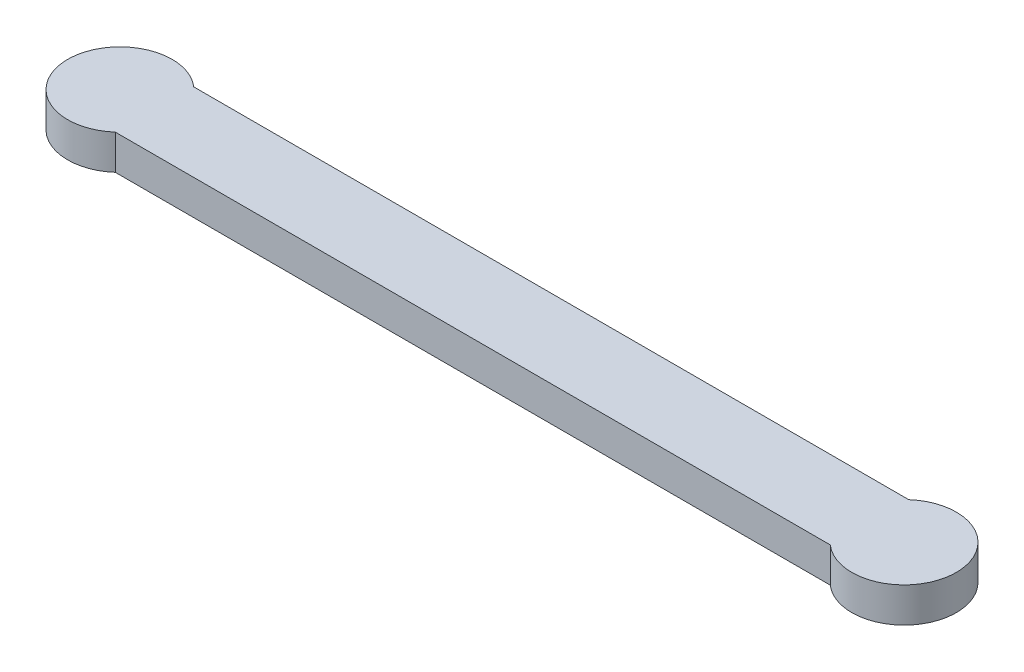
ISO-10303-21;
HEADER;
FILE_DESCRIPTION(('STEP AP214'),'2;1');
FILE_NAME('part.step','',(''),(''),'','','');
FILE_SCHEMA(('AUTOMOTIVE_DESIGN { 1 0 10303 214 1 1 1 1 }'));
ENDSEC;
DATA;
#1=APPLICATION_CONTEXT('core data for automotive mechanical design processes');
#2=APPLICATION_PROTOCOL_DEFINITION('international standard','automotive_design',2000,#1);
#3=PRODUCT_CONTEXT('',#1,'mechanical');
#4=PRODUCT('Part','Part','',(#3));
#5=PRODUCT_RELATED_PRODUCT_CATEGORY('part','',(#4));
#6=PRODUCT_DEFINITION_FORMATION('','',#4);
#7=PRODUCT_DEFINITION_CONTEXT('part definition',#1,'design');
#8=PRODUCT_DEFINITION('design','',#6,#7);
#9=PRODUCT_DEFINITION_SHAPE('','',#8);
#10=(LENGTH_UNIT() NAMED_UNIT(*) SI_UNIT(.MILLI.,.METRE.));
#11=(NAMED_UNIT(*) PLANE_ANGLE_UNIT() SI_UNIT($,.RADIAN.));
#12=(NAMED_UNIT(*) SI_UNIT($,.STERADIAN.) SOLID_ANGLE_UNIT());
#13=UNCERTAINTY_MEASURE_WITH_UNIT(LENGTH_MEASURE(1.E-05),#10,'distance_accuracy_value','');
#14=(GEOMETRIC_REPRESENTATION_CONTEXT(3) GLOBAL_UNCERTAINTY_ASSIGNED_CONTEXT((#13)) GLOBAL_UNIT_ASSIGNED_CONTEXT((#10,
#11,#12)) REPRESENTATION_CONTEXT('',''));
#15=CARTESIAN_POINT('',(0.,0.,0.));
#16=DIRECTION('',(0.,0.,1.));
#17=DIRECTION('',(1.,0.,0.));
#18=AXIS2_PLACEMENT_3D('',#15,#16,#17);
#19=CARTESIAN_POINT('',(0.,0.,0.));
#20=DIRECTION('',(0.,1.,0.));
#21=DIRECTION('',(0.,0.,1.));
#22=AXIS2_PLACEMENT_3D('',#19,#20,#21);
#23=PLANE('',#22);
#24=CARTESIAN_POINT('',(0.,0.,0.));
#25=DIRECTION('',(0.,1.,0.));
#26=DIRECTION('',(0.,0.,1.));
#27=AXIS2_PLACEMENT_3D('',#24,#25,#26);
#28=CIRCLE('',#27,6.);
#29=CARTESIAN_POINT('',(3.96862696659689,0.,-4.5));
#30=VERTEX_POINT('',#29);
#31=CARTESIAN_POINT('',(3.96862696659689,0.,4.5));
#32=VERTEX_POINT('',#31);
#33=EDGE_CURVE('E111',#30,#32,#28,.T.);
#34=ORIENTED_EDGE('',*,*,#33,.F.);
#35=DIRECTION('',(1.,0.,0.));
#36=VECTOR('',#35,1.);
#37=CARTESIAN_POINT('',(0.,0.,-4.5));
#38=LINE('',#37,#36);
#39=CARTESIAN_POINT('',(86.0313730334031,0.,-4.5));
#40=VERTEX_POINT('',#39);
#41=EDGE_CURVE('E137',#30,#40,#38,.T.);
#42=ORIENTED_EDGE('',*,*,#41,.T.);
#43=CARTESIAN_POINT('',(90.,0.,0.));
#44=DIRECTION('',(0.,1.,0.));
#45=DIRECTION('',(0.,0.,1.));
#46=AXIS2_PLACEMENT_3D('',#43,#44,#45);
#47=CIRCLE('',#46,6.);
#48=CARTESIAN_POINT('',(86.0313730334031,0.,4.5));
#49=VERTEX_POINT('',#48);
#50=EDGE_CURVE('E124',#49,#40,#47,.T.);
#51=ORIENTED_EDGE('',*,*,#50,.F.);
#52=DIRECTION('',(1.,0.,0.));
#53=VECTOR('',#52,1.);
#54=CARTESIAN_POINT('',(0.,0.,4.5));
#55=LINE('',#54,#53);
#56=EDGE_CURVE('E132',#32,#49,#55,.T.);
#57=ORIENTED_EDGE('',*,*,#56,.F.);
#58=EDGE_LOOP('',(#34,#42,#51,#57));
#59=FACE_BOUND('',#58,.T.);
#60=ADVANCED_FACE('F67',(#59),#23,.F.);
#61=CARTESIAN_POINT('',(0.,4.,4.5));
#62=DIRECTION('',(0.,0.,-1.));
#63=DIRECTION('',(-1.,0.,0.));
#64=AXIS2_PLACEMENT_3D('',#61,#62,#63);
#65=PLANE('',#64);
#66=ORIENTED_EDGE('',*,*,#56,.T.);
#67=DIRECTION('',(0.,-1.,0.));
#68=VECTOR('',#67,1.);
#69=CARTESIAN_POINT('',(86.0313730334031,4.,4.5));
#70=LINE('',#69,#68);
#71=CARTESIAN_POINT('',(86.0313730334031,4.,4.5));
#72=VERTEX_POINT('',#71);
#73=EDGE_CURVE('E116',#72,#49,#70,.T.);
#74=ORIENTED_EDGE('',*,*,#73,.F.);
#75=DIRECTION('',(1.,0.,0.));
#76=VECTOR('',#75,1.);
#77=CARTESIAN_POINT('',(0.,4.,4.5));
#78=LINE('',#77,#76);
#79=CARTESIAN_POINT('',(3.96862696659689,4.,4.5));
#80=VERTEX_POINT('',#79);
#81=EDGE_CURVE('E122',#80,#72,#78,.T.);
#82=ORIENTED_EDGE('',*,*,#81,.F.);
#83=DIRECTION('',(0.,-1.,0.));
#84=VECTOR('',#83,1.);
#85=CARTESIAN_POINT('',(3.96862696659689,4.,4.5));
#86=LINE('',#85,#84);
#87=EDGE_CURVE('E106',#80,#32,#86,.T.);
#88=ORIENTED_EDGE('',*,*,#87,.T.);
#89=EDGE_LOOP('',(#66,#74,#82,#88));
#90=FACE_BOUND('',#89,.T.);
#91=ADVANCED_FACE('F126',(#90),#65,.F.);
#92=CARTESIAN_POINT('',(0.,4.,0.));
#93=DIRECTION('',(0.,1.,0.));
#94=DIRECTION('',(0.,0.,1.));
#95=AXIS2_PLACEMENT_3D('',#92,#93,#94);
#96=PLANE('',#95);
#97=DIRECTION('',(1.,0.,0.));
#98=VECTOR('',#97,1.);
#99=CARTESIAN_POINT('',(0.,4.,-4.5));
#100=LINE('',#99,#98);
#101=CARTESIAN_POINT('',(3.96862696659689,4.,-4.5));
#102=VERTEX_POINT('',#101);
#103=CARTESIAN_POINT('',(86.0313730334031,4.,-4.5));
#104=VERTEX_POINT('',#103);
#105=EDGE_CURVE('E123',#102,#104,#100,.T.);
#106=ORIENTED_EDGE('',*,*,#105,.F.);
#107=CARTESIAN_POINT('',(0.,4.,0.));
#108=DIRECTION('',(0.,1.,0.));
#109=DIRECTION('',(0.,0.,1.));
#110=AXIS2_PLACEMENT_3D('',#107,#108,#109);
#111=CIRCLE('',#110,6.);
#112=EDGE_CURVE('E109',#102,#80,#111,.T.);
#113=ORIENTED_EDGE('',*,*,#112,.T.);
#114=ORIENTED_EDGE('',*,*,#81,.T.);
#115=CARTESIAN_POINT('',(90.,4.,0.));
#116=DIRECTION('',(0.,1.,0.));
#117=DIRECTION('',(0.,0.,1.));
#118=AXIS2_PLACEMENT_3D('',#115,#116,#117);
#119=CIRCLE('',#118,6.);
#120=EDGE_CURVE('E127',#72,#104,#119,.T.);
#121=ORIENTED_EDGE('',*,*,#120,.T.);
#122=EDGE_LOOP('',(#106,#113,#114,#121));
#123=FACE_BOUND('',#122,.T.);
#124=ADVANCED_FACE('F120',(#123),#96,.T.);
#125=CARTESIAN_POINT('',(0.,4.,0.));
#126=DIRECTION('',(0.,-1.,0.));
#127=DIRECTION('',(0.,0.,-1.));
#128=AXIS2_PLACEMENT_3D('',#125,#126,#127);
#129=CYLINDRICAL_SURFACE('',#128,6.);
#130=ORIENTED_EDGE('',*,*,#112,.F.);
#131=DIRECTION('',(0.,-1.,0.));
#132=VECTOR('',#131,1.);
#133=CARTESIAN_POINT('',(3.96862696659689,4.,-4.5));
#134=LINE('',#133,#132);
#135=EDGE_CURVE('E12',#102,#30,#134,.T.);
#136=ORIENTED_EDGE('',*,*,#135,.T.);
#137=ORIENTED_EDGE('',*,*,#33,.T.);
#138=ORIENTED_EDGE('',*,*,#87,.F.);
#139=EDGE_LOOP('',(#130,#136,#137,#138));
#140=FACE_BOUND('',#139,.T.);
#141=ADVANCED_FACE('F108',(#140),#129,.T.);
#142=CARTESIAN_POINT('',(90.,4.,0.));
#143=DIRECTION('',(0.,-1.,0.));
#144=DIRECTION('',(0.,0.,-1.));
#145=AXIS2_PLACEMENT_3D('',#142,#143,#144);
#146=CYLINDRICAL_SURFACE('',#145,6.);
#147=ORIENTED_EDGE('',*,*,#50,.T.);
#148=DIRECTION('',(0.,-1.,0.));
#149=VECTOR('',#148,1.);
#150=CARTESIAN_POINT('',(86.0313730334031,4.,-4.5));
#151=LINE('',#150,#149);
#152=EDGE_CURVE('E75',#40,#104,#151,.F.);
#153=ORIENTED_EDGE('',*,*,#152,.T.);
#154=ORIENTED_EDGE('',*,*,#120,.F.);
#155=ORIENTED_EDGE('',*,*,#73,.T.);
#156=EDGE_LOOP('',(#147,#153,#154,#155));
#157=FACE_BOUND('',#156,.T.);
#158=ADVANCED_FACE('F141',(#157),#146,.T.);
#159=CARTESIAN_POINT('',(0.,4.,-4.5));
#160=DIRECTION('',(0.,0.,-1.));
#161=DIRECTION('',(-1.,0.,0.));
#162=AXIS2_PLACEMENT_3D('',#159,#160,#161);
#163=PLANE('',#162);
#164=ORIENTED_EDGE('',*,*,#135,.F.);
#165=ORIENTED_EDGE('',*,*,#105,.T.);
#166=ORIENTED_EDGE('',*,*,#152,.F.);
#167=ORIENTED_EDGE('',*,*,#41,.F.);
#168=EDGE_LOOP('',(#164,#165,#166,#167));
#169=FACE_BOUND('',#168,.T.);
#170=ADVANCED_FACE('F69',(#169),#163,.T.);
#171=CLOSED_SHELL('',(#60,#91,#124,#141,#158,#170));
#172=MANIFOLD_SOLID_BREP('B2',#171);
#173=ADVANCED_BREP_SHAPE_REPRESENTATION('',(#18,#172),#14);
#174=SHAPE_DEFINITION_REPRESENTATION(#9,#173);
ENDSEC;
END-ISO-10303-21;
